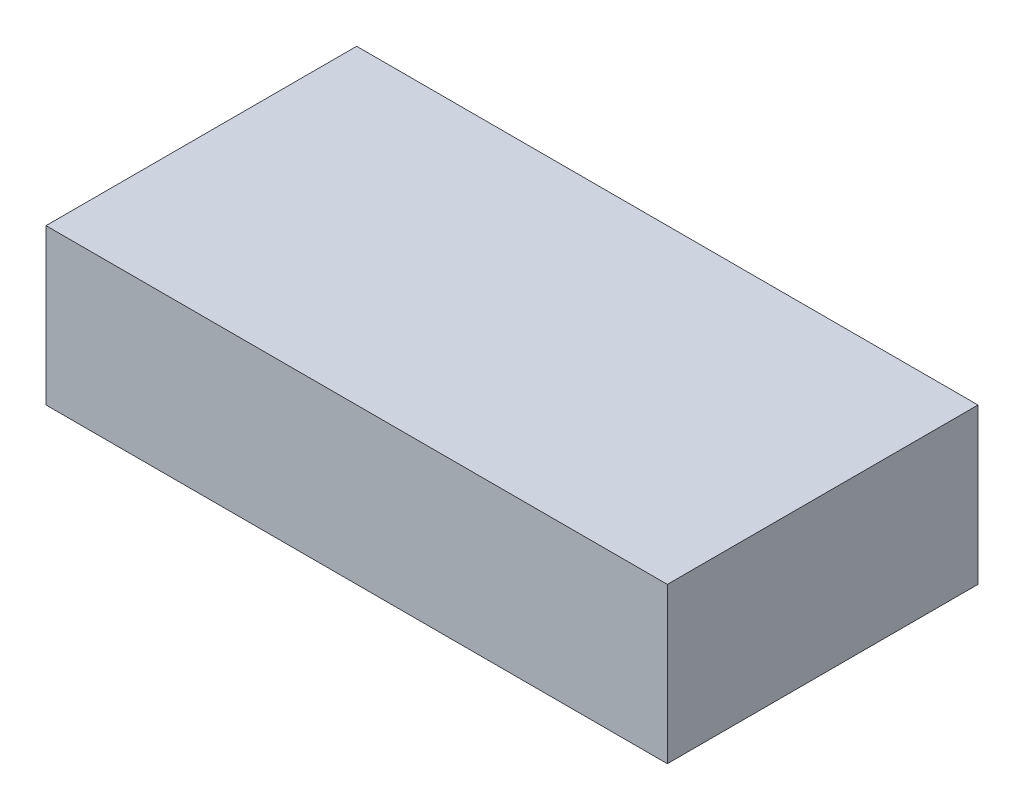
ISO-10303-21;
HEADER;
FILE_DESCRIPTION(('STEP AP214'),'2;1');
FILE_NAME('part.step','',(''),(''),'','','');
FILE_SCHEMA(('AUTOMOTIVE_DESIGN { 1 0 10303 214 1 1 1 1 }'));
ENDSEC;
DATA;
#1=APPLICATION_CONTEXT('core data for automotive mechanical design processes');
#2=APPLICATION_PROTOCOL_DEFINITION('international standard','automotive_design',2000,#1);
#3=PRODUCT_CONTEXT('',#1,'mechanical');
#4=PRODUCT('Part','Part','',(#3));
#5=PRODUCT_RELATED_PRODUCT_CATEGORY('part','',(#4));
#6=PRODUCT_DEFINITION_FORMATION('','',#4);
#7=PRODUCT_DEFINITION_CONTEXT('part definition',#1,'design');
#8=PRODUCT_DEFINITION('design','',#6,#7);
#9=PRODUCT_DEFINITION_SHAPE('','',#8);
#10=(LENGTH_UNIT() NAMED_UNIT(*) SI_UNIT(.MILLI.,.METRE.));
#11=(NAMED_UNIT(*) PLANE_ANGLE_UNIT() SI_UNIT($,.RADIAN.));
#12=(NAMED_UNIT(*) SI_UNIT($,.STERADIAN.) SOLID_ANGLE_UNIT());
#13=UNCERTAINTY_MEASURE_WITH_UNIT(LENGTH_MEASURE(1.E-05),#10,'distance_accuracy_value','');
#14=(GEOMETRIC_REPRESENTATION_CONTEXT(3) GLOBAL_UNCERTAINTY_ASSIGNED_CONTEXT((#13)) GLOBAL_UNIT_ASSIGNED_CONTEXT((#10,
#11,#12)) REPRESENTATION_CONTEXT('',''));
#15=CARTESIAN_POINT('',(0.,0.,0.));
#16=DIRECTION('',(0.,0.,1.));
#17=DIRECTION('',(1.,0.,0.));
#18=AXIS2_PLACEMENT_3D('',#15,#16,#17);
#19=CARTESIAN_POINT('',(0.,5.,-20.));
#20=DIRECTION('',(1.,0.,0.));
#21=DIRECTION('',(0.,0.,-1.));
#22=AXIS2_PLACEMENT_3D('',#19,#20,#21);
#23=PLANE('',#22);
#24=DIRECTION('',(0.,0.,1.));
#25=VECTOR('',#24,1.);
#26=CARTESIAN_POINT('',(0.,-5.,-20.));
#27=LINE('',#26,#25);
#28=CARTESIAN_POINT('',(0.,-5.,-20.));
#29=VERTEX_POINT('',#28);
#30=CARTESIAN_POINT('',(0.,-5.,0.));
#31=VERTEX_POINT('',#30);
#32=EDGE_CURVE('E104',#29,#31,#27,.T.);
#33=ORIENTED_EDGE('',*,*,#32,.T.);
#34=DIRECTION('',(0.,-1.,0.));
#35=VECTOR('',#34,1.);
#36=CARTESIAN_POINT('',(0.,5.,0.));
#37=LINE('',#36,#35);
#38=CARTESIAN_POINT('',(0.,5.,0.));
#39=VERTEX_POINT('',#38);
#40=EDGE_CURVE('E11',#39,#31,#37,.T.);
#41=ORIENTED_EDGE('',*,*,#40,.F.);
#42=DIRECTION('',(0.,0.,1.));
#43=VECTOR('',#42,1.);
#44=CARTESIAN_POINT('',(0.,5.,-20.));
#45=LINE('',#44,#43);
#46=CARTESIAN_POINT('',(0.,5.,-20.));
#47=VERTEX_POINT('',#46);
#48=EDGE_CURVE('E92',#47,#39,#45,.T.);
#49=ORIENTED_EDGE('',*,*,#48,.F.);
#50=DIRECTION('',(0.,-1.,0.));
#51=VECTOR('',#50,1.);
#52=CARTESIAN_POINT('',(0.,5.,-20.));
#53=LINE('',#52,#51);
#54=EDGE_CURVE('E100',#47,#29,#53,.T.);
#55=ORIENTED_EDGE('',*,*,#54,.T.);
#56=EDGE_LOOP('',(#33,#41,#49,#55));
#57=FACE_BOUND('',#56,.T.);
#58=ADVANCED_FACE('F41',(#57),#23,.F.);
#59=CARTESIAN_POINT('',(0.,5.,0.));
#60=DIRECTION('',(0.,0.,-1.));
#61=DIRECTION('',(-1.,0.,0.));
#62=AXIS2_PLACEMENT_3D('',#59,#60,#61);
#63=PLANE('',#62);
#64=DIRECTION('',(1.,0.,0.));
#65=VECTOR('',#64,1.);
#66=CARTESIAN_POINT('',(0.,-5.,0.));
#67=LINE('',#66,#65);
#68=CARTESIAN_POINT('',(40.,-5.,0.));
#69=VERTEX_POINT('',#68);
#70=EDGE_CURVE('E96',#31,#69,#67,.T.);
#71=ORIENTED_EDGE('',*,*,#70,.T.);
#72=DIRECTION('',(0.,-1.,0.));
#73=VECTOR('',#72,1.);
#74=CARTESIAN_POINT('',(40.,5.,0.));
#75=LINE('',#74,#73);
#76=CARTESIAN_POINT('',(40.,5.,0.));
#77=VERTEX_POINT('',#76);
#78=EDGE_CURVE('E49',#77,#69,#75,.T.);
#79=ORIENTED_EDGE('',*,*,#78,.F.);
#80=DIRECTION('',(1.,0.,0.));
#81=VECTOR('',#80,1.);
#82=CARTESIAN_POINT('',(0.,5.,0.));
#83=LINE('',#82,#81);
#84=EDGE_CURVE('E87',#39,#77,#83,.T.);
#85=ORIENTED_EDGE('',*,*,#84,.F.);
#86=ORIENTED_EDGE('',*,*,#40,.T.);
#87=EDGE_LOOP('',(#71,#79,#85,#86));
#88=FACE_BOUND('',#87,.T.);
#89=ADVANCED_FACE('F95',(#88),#63,.F.);
#90=CARTESIAN_POINT('',(40.,5.,0.));
#91=DIRECTION('',(-1.,0.,0.));
#92=DIRECTION('',(0.,0.,1.));
#93=AXIS2_PLACEMENT_3D('',#90,#91,#92);
#94=PLANE('',#93);
#95=DIRECTION('',(0.,0.,-1.));
#96=VECTOR('',#95,1.);
#97=CARTESIAN_POINT('',(40.,-5.,0.));
#98=LINE('',#97,#96);
#99=CARTESIAN_POINT('',(40.,-5.,-20.));
#100=VERTEX_POINT('',#99);
#101=EDGE_CURVE('E74',#69,#100,#98,.T.);
#102=ORIENTED_EDGE('',*,*,#101,.T.);
#103=DIRECTION('',(0.,-1.,0.));
#104=VECTOR('',#103,1.);
#105=CARTESIAN_POINT('',(40.,5.,-20.));
#106=LINE('',#105,#104);
#107=CARTESIAN_POINT('',(40.,5.,-20.));
#108=VERTEX_POINT('',#107);
#109=EDGE_CURVE('E97',#108,#100,#106,.T.);
#110=ORIENTED_EDGE('',*,*,#109,.F.);
#111=DIRECTION('',(0.,0.,-1.));
#112=VECTOR('',#111,1.);
#113=CARTESIAN_POINT('',(40.,5.,0.));
#114=LINE('',#113,#112);
#115=EDGE_CURVE('E90',#77,#108,#114,.T.);
#116=ORIENTED_EDGE('',*,*,#115,.F.);
#117=ORIENTED_EDGE('',*,*,#78,.T.);
#118=EDGE_LOOP('',(#102,#110,#116,#117));
#119=FACE_BOUND('',#118,.T.);
#120=ADVANCED_FACE('F98',(#119),#94,.F.);
#121=CARTESIAN_POINT('',(40.,5.,-20.));
#122=DIRECTION('',(0.,0.,1.));
#123=DIRECTION('',(1.,0.,0.));
#124=AXIS2_PLACEMENT_3D('',#121,#122,#123);
#125=PLANE('',#124);
#126=DIRECTION('',(-1.,0.,0.));
#127=VECTOR('',#126,1.);
#128=CARTESIAN_POINT('',(40.,-5.,-20.));
#129=LINE('',#128,#127);
#130=EDGE_CURVE('E80',#100,#29,#129,.T.);
#131=ORIENTED_EDGE('',*,*,#130,.T.);
#132=ORIENTED_EDGE('',*,*,#54,.F.);
#133=DIRECTION('',(-1.,0.,0.));
#134=VECTOR('',#133,1.);
#135=CARTESIAN_POINT('',(40.,5.,-20.));
#136=LINE('',#135,#134);
#137=EDGE_CURVE('E57',#108,#47,#136,.T.);
#138=ORIENTED_EDGE('',*,*,#137,.F.);
#139=ORIENTED_EDGE('',*,*,#109,.T.);
#140=EDGE_LOOP('',(#131,#132,#138,#139));
#141=FACE_BOUND('',#140,.T.);
#142=ADVANCED_FACE('F111',(#141),#125,.F.);
#143=CARTESIAN_POINT('',(0.,5.,0.));
#144=DIRECTION('',(0.,1.,0.));
#145=DIRECTION('',(0.,0.,1.));
#146=AXIS2_PLACEMENT_3D('',#143,#144,#145);
#147=PLANE('',#146);
#148=ORIENTED_EDGE('',*,*,#48,.T.);
#149=ORIENTED_EDGE('',*,*,#84,.T.);
#150=ORIENTED_EDGE('',*,*,#115,.T.);
#151=ORIENTED_EDGE('',*,*,#137,.T.);
#152=EDGE_LOOP('',(#148,#149,#150,#151));
#153=FACE_BOUND('',#152,.T.);
#154=ADVANCED_FACE('F88',(#153),#147,.T.);
#155=CARTESIAN_POINT('',(0.,-5.,0.));
#156=DIRECTION('',(0.,1.,0.));
#157=DIRECTION('',(0.,0.,1.));
#158=AXIS2_PLACEMENT_3D('',#155,#156,#157);
#159=PLANE('',#158);
#160=ORIENTED_EDGE('',*,*,#32,.F.);
#161=ORIENTED_EDGE('',*,*,#130,.F.);
#162=ORIENTED_EDGE('',*,*,#101,.F.);
#163=ORIENTED_EDGE('',*,*,#70,.F.);
#164=EDGE_LOOP('',(#160,#161,#162,#163));
#165=FACE_BOUND('',#164,.T.);
#166=ADVANCED_FACE('F114',(#165),#159,.F.);
#167=CLOSED_SHELL('',(#58,#89,#120,#142,#154,#166));
#168=MANIFOLD_SOLID_BREP('B2',#167);
#169=ADVANCED_BREP_SHAPE_REPRESENTATION('',(#18,#168),#14);
#170=SHAPE_DEFINITION_REPRESENTATION(#9,#169);
ENDSEC;
END-ISO-10303-21;
